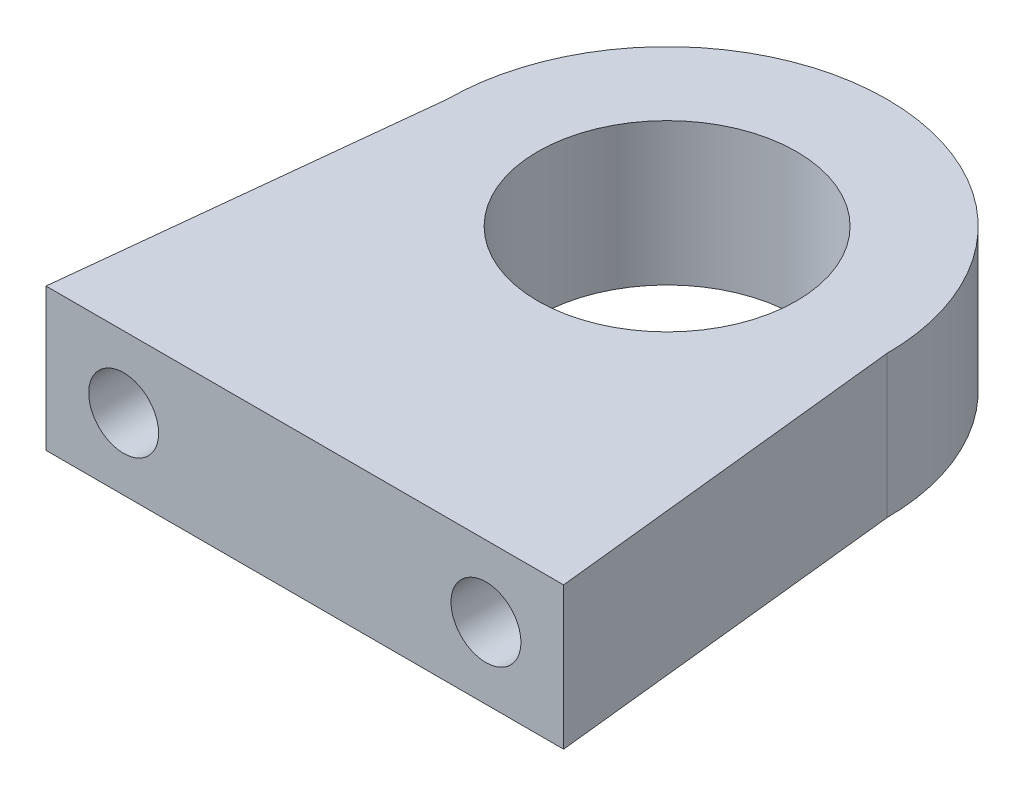
ISO-10303-21;
HEADER;
FILE_DESCRIPTION(('STEP AP214'),'2;1');
FILE_NAME('part.step','',(''),(''),'','','');
FILE_SCHEMA(('AUTOMOTIVE_DESIGN { 1 0 10303 214 1 1 1 1 }'));
ENDSEC;
DATA;
#1=APPLICATION_CONTEXT('core data for automotive mechanical design processes');
#2=APPLICATION_PROTOCOL_DEFINITION('international standard','automotive_design',2000,#1);
#3=PRODUCT_CONTEXT('',#1,'mechanical');
#4=PRODUCT('Part','Part','',(#3));
#5=PRODUCT_RELATED_PRODUCT_CATEGORY('part','',(#4));
#6=PRODUCT_DEFINITION_FORMATION('','',#4);
#7=PRODUCT_DEFINITION_CONTEXT('part definition',#1,'design');
#8=PRODUCT_DEFINITION('design','',#6,#7);
#9=PRODUCT_DEFINITION_SHAPE('','',#8);
#10=(LENGTH_UNIT() NAMED_UNIT(*) SI_UNIT(.MILLI.,.METRE.));
#11=(NAMED_UNIT(*) PLANE_ANGLE_UNIT() SI_UNIT($,.RADIAN.));
#12=(NAMED_UNIT(*) SI_UNIT($,.STERADIAN.) SOLID_ANGLE_UNIT());
#13=UNCERTAINTY_MEASURE_WITH_UNIT(LENGTH_MEASURE(1.E-05),#10,'distance_accuracy_value','');
#14=(GEOMETRIC_REPRESENTATION_CONTEXT(3) GLOBAL_UNCERTAINTY_ASSIGNED_CONTEXT((#13)) GLOBAL_UNIT_ASSIGNED_CONTEXT((#10,
#11,#12)) REPRESENTATION_CONTEXT('',''));
#15=CARTESIAN_POINT('',(0.,0.,0.));
#16=DIRECTION('',(0.,0.,1.));
#17=DIRECTION('',(1.,0.,0.));
#18=AXIS2_PLACEMENT_3D('',#15,#16,#17);
#19=CARTESIAN_POINT('',(0.,5.5,-14.));
#20=DIRECTION('',(0.,-1.,0.));
#21=DIRECTION('',(0.,0.,-1.));
#22=AXIS2_PLACEMENT_3D('',#19,#20,#21);
#23=PLANE('',#22);
#24=DIRECTION('',(1.,0.,0.));
#25=VECTOR('',#24,1.);
#26=CARTESIAN_POINT('',(-10.,5.5,0.));
#27=LINE('',#26,#25);
#28=CARTESIAN_POINT('',(-10.,5.5,0.));
#29=VERTEX_POINT('',#28);
#30=CARTESIAN_POINT('',(10.,5.5,0.));
#31=VERTEX_POINT('',#30);
#32=EDGE_CURVE('E92',#29,#31,#27,.T.);
#33=ORIENTED_EDGE('',*,*,#32,.T.);
#34=DIRECTION('',(-0.106533123634265,0.,-0.994309153919809));
#35=VECTOR('',#34,1.);
#36=CARTESIAN_POINT('',(10.,5.5,0.));
#37=LINE('',#36,#35);
#38=CARTESIAN_POINT('',(8.5,5.5,-14.));
#39=VERTEX_POINT('',#38);
#40=EDGE_CURVE('E87',#31,#39,#37,.T.);
#41=ORIENTED_EDGE('',*,*,#40,.T.);
#42=CARTESIAN_POINT('',(0.,5.5,-14.));
#43=DIRECTION('',(0.,1.,0.));
#44=DIRECTION('',(0.,0.,-1.));
#45=AXIS2_PLACEMENT_3D('',#42,#43,#44);
#46=CIRCLE('',#45,8.5);
#47=CARTESIAN_POINT('',(-8.5,5.5,-14.));
#48=VERTEX_POINT('',#47);
#49=EDGE_CURVE('E90',#39,#48,#46,.T.);
#50=ORIENTED_EDGE('',*,*,#49,.T.);
#51=DIRECTION('',(-0.106533123634265,0.,0.994309153919809));
#52=VECTOR('',#51,1.);
#53=CARTESIAN_POINT('',(-10.,5.5,0.));
#54=LINE('',#53,#52);
#55=EDGE_CURVE('E57',#48,#29,#54,.T.);
#56=ORIENTED_EDGE('',*,*,#55,.T.);
#57=EDGE_LOOP('',(#33,#41,#50,#56));
#58=FACE_BOUND('',#57,.T.);
#59=CARTESIAN_POINT('',(0.,5.5,-14.));
#60=DIRECTION('',(0.,1.,0.));
#61=DIRECTION('',(0.,0.,1.));
#62=AXIS2_PLACEMENT_3D('',#59,#60,#61);
#63=CIRCLE('',#62,5.);
#64=CARTESIAN_POINT('',(0.,5.5,-9.));
#65=VERTEX_POINT('',#64);
#66=EDGE_CURVE('E112',#65,#65,#63,.T.);
#67=ORIENTED_EDGE('',*,*,#66,.F.);
#68=EDGE_LOOP('',(#67));
#69=FACE_BOUND('',#68,.T.);
#70=ADVANCED_FACE('F39',(#58,#69),#23,.F.);
#71=CARTESIAN_POINT('',(0.,0.,-14.));
#72=DIRECTION('',(0.,-1.,0.));
#73=DIRECTION('',(0.,0.,-1.));
#74=AXIS2_PLACEMENT_3D('',#71,#72,#73);
#75=PLANE('',#74);
#76=DIRECTION('',(1.,0.,0.));
#77=VECTOR('',#76,1.);
#78=CARTESIAN_POINT('',(-10.,0.,0.));
#79=LINE('',#78,#77);
#80=CARTESIAN_POINT('',(-10.,0.,0.));
#81=VERTEX_POINT('',#80);
#82=CARTESIAN_POINT('',(10.,0.,0.));
#83=VERTEX_POINT('',#82);
#84=EDGE_CURVE('E108',#81,#83,#79,.T.);
#85=ORIENTED_EDGE('',*,*,#84,.F.);
#86=DIRECTION('',(-0.106533123634265,0.,0.994309153919809));
#87=VECTOR('',#86,1.);
#88=CARTESIAN_POINT('',(-10.,0.,0.));
#89=LINE('',#88,#87);
#90=CARTESIAN_POINT('',(-8.5,0.,-14.));
#91=VERTEX_POINT('',#90);
#92=EDGE_CURVE('E80',#91,#81,#89,.T.);
#93=ORIENTED_EDGE('',*,*,#92,.F.);
#94=CARTESIAN_POINT('',(0.,0.,-14.));
#95=DIRECTION('',(0.,1.,0.));
#96=DIRECTION('',(0.,0.,-1.));
#97=AXIS2_PLACEMENT_3D('',#94,#95,#96);
#98=CIRCLE('',#97,8.5);
#99=CARTESIAN_POINT('',(8.5,0.,-14.));
#100=VERTEX_POINT('',#99);
#101=EDGE_CURVE('E74',#100,#91,#98,.T.);
#102=ORIENTED_EDGE('',*,*,#101,.F.);
#103=DIRECTION('',(-0.106533123634265,0.,-0.994309153919809));
#104=VECTOR('',#103,1.);
#105=CARTESIAN_POINT('',(10.,0.,0.));
#106=LINE('',#105,#104);
#107=EDGE_CURVE('E97',#83,#100,#106,.T.);
#108=ORIENTED_EDGE('',*,*,#107,.F.);
#109=EDGE_LOOP('',(#85,#93,#102,#108));
#110=FACE_BOUND('',#109,.T.);
#111=CARTESIAN_POINT('',(0.,0.,-14.));
#112=DIRECTION('',(0.,1.,0.));
#113=DIRECTION('',(0.,0.,1.));
#114=AXIS2_PLACEMENT_3D('',#111,#112,#113);
#115=CIRCLE('',#114,5.);
#116=CARTESIAN_POINT('',(0.,0.,-9.));
#117=VERTEX_POINT('',#116);
#118=EDGE_CURVE('E130',#117,#117,#115,.T.);
#119=ORIENTED_EDGE('',*,*,#118,.T.);
#120=EDGE_LOOP('',(#119));
#121=FACE_BOUND('',#120,.T.);
#122=ADVANCED_FACE('F125',(#110,#121),#75,.T.);
#123=CARTESIAN_POINT('',(-10.,5.5,0.));
#124=DIRECTION('',(0.,0.,-1.));
#125=DIRECTION('',(-1.,0.,0.));
#126=AXIS2_PLACEMENT_3D('',#123,#124,#125);
#127=PLANE('',#126);
#128=CARTESIAN_POINT('',(-7.,2.75,0.));
#129=DIRECTION('',(0.,0.,1.));
#130=DIRECTION('',(1.,0.,0.));
#131=AXIS2_PLACEMENT_3D('',#128,#129,#130);
#132=CIRCLE('',#131,1.35);
#133=CARTESIAN_POINT('',(-5.65,2.75,0.));
#134=VERTEX_POINT('',#133);
#135=EDGE_CURVE('E146',#134,#134,#132,.T.);
#136=ORIENTED_EDGE('',*,*,#135,.F.);
#137=EDGE_LOOP('',(#136));
#138=FACE_BOUND('',#137,.T.);
#139=CARTESIAN_POINT('',(7.,2.75,0.));
#140=DIRECTION('',(0.,0.,1.));
#141=DIRECTION('',(-1.,0.,0.));
#142=AXIS2_PLACEMENT_3D('',#139,#140,#141);
#143=CIRCLE('',#142,1.35);
#144=CARTESIAN_POINT('',(5.65,2.75,0.));
#145=VERTEX_POINT('',#144);
#146=EDGE_CURVE('E138',#145,#145,#143,.T.);
#147=ORIENTED_EDGE('',*,*,#146,.F.);
#148=EDGE_LOOP('',(#147));
#149=FACE_BOUND('',#148,.T.);
#150=ORIENTED_EDGE('',*,*,#84,.T.);
#151=DIRECTION('',(0.,-1.,0.));
#152=VECTOR('',#151,1.);
#153=CARTESIAN_POINT('',(10.,5.5,0.));
#154=LINE('',#153,#152);
#155=EDGE_CURVE('E11',#31,#83,#154,.T.);
#156=ORIENTED_EDGE('',*,*,#155,.F.);
#157=ORIENTED_EDGE('',*,*,#32,.F.);
#158=DIRECTION('',(0.,-1.,0.));
#159=VECTOR('',#158,1.);
#160=CARTESIAN_POINT('',(-10.,5.5,0.));
#161=LINE('',#160,#159);
#162=EDGE_CURVE('E104',#29,#81,#161,.T.);
#163=ORIENTED_EDGE('',*,*,#162,.T.);
#164=EDGE_LOOP('',(#150,#156,#157,#163));
#165=FACE_BOUND('',#164,.T.);
#166=ADVANCED_FACE('F41',(#138,#149,#165),#127,.F.);
#167=CARTESIAN_POINT('',(10.,5.5,0.));
#168=DIRECTION('',(-0.994309153919809,0.,0.106533123634265));
#169=DIRECTION('',(0.106533123634265,0.,0.994309153919809));
#170=AXIS2_PLACEMENT_3D('',#167,#168,#169);
#171=PLANE('',#170);
#172=ORIENTED_EDGE('',*,*,#107,.T.);
#173=DIRECTION('',(0.,-1.,0.));
#174=VECTOR('',#173,1.);
#175=CARTESIAN_POINT('',(8.5,5.5,-14.));
#176=LINE('',#175,#174);
#177=EDGE_CURVE('E49',#39,#100,#176,.T.);
#178=ORIENTED_EDGE('',*,*,#177,.F.);
#179=ORIENTED_EDGE('',*,*,#40,.F.);
#180=ORIENTED_EDGE('',*,*,#155,.T.);
#181=EDGE_LOOP('',(#172,#178,#179,#180));
#182=FACE_BOUND('',#181,.T.);
#183=ADVANCED_FACE('F96',(#182),#171,.F.);
#184=CARTESIAN_POINT('',(0.,5.5,-14.));
#185=DIRECTION('',(0.,-1.,0.));
#186=DIRECTION('',(0.,0.,-1.));
#187=AXIS2_PLACEMENT_3D('',#184,#185,#186);
#188=CYLINDRICAL_SURFACE('',#187,8.5);
#189=ORIENTED_EDGE('',*,*,#101,.T.);
#190=DIRECTION('',(0.,-1.,0.));
#191=VECTOR('',#190,1.);
#192=CARTESIAN_POINT('',(-8.5,5.5,-14.));
#193=LINE('',#192,#191);
#194=EDGE_CURVE('E99',#48,#91,#193,.T.);
#195=ORIENTED_EDGE('',*,*,#194,.F.);
#196=ORIENTED_EDGE('',*,*,#49,.F.);
#197=ORIENTED_EDGE('',*,*,#177,.T.);
#198=EDGE_LOOP('',(#189,#195,#196,#197));
#199=FACE_BOUND('',#198,.T.);
#200=ADVANCED_FACE('F100',(#199),#188,.T.);
#201=CARTESIAN_POINT('',(-10.,5.5,0.));
#202=DIRECTION('',(0.994309153919809,0.,0.106533123634265));
#203=DIRECTION('',(0.106533123634265,0.,-0.994309153919809));
#204=AXIS2_PLACEMENT_3D('',#201,#202,#203);
#205=PLANE('',#204);
#206=ORIENTED_EDGE('',*,*,#92,.T.);
#207=ORIENTED_EDGE('',*,*,#162,.F.);
#208=ORIENTED_EDGE('',*,*,#55,.F.);
#209=ORIENTED_EDGE('',*,*,#194,.T.);
#210=EDGE_LOOP('',(#206,#207,#208,#209));
#211=FACE_BOUND('',#210,.T.);
#212=ADVANCED_FACE('F122',(#211),#205,.F.);
#213=CARTESIAN_POINT('',(0.,5.5,-14.));
#214=DIRECTION('',(0.,-1.,0.));
#215=DIRECTION('',(0.,0.,-1.));
#216=AXIS2_PLACEMENT_3D('',#213,#214,#215);
#217=CYLINDRICAL_SURFACE('',#216,5.);
#218=ORIENTED_EDGE('',*,*,#66,.T.);
#219=EDGE_LOOP('',(#218));
#220=FACE_BOUND('',#219,.T.);
#221=ORIENTED_EDGE('',*,*,#118,.F.);
#222=EDGE_LOOP('',(#221));
#223=FACE_BOUND('',#222,.T.);
#224=ADVANCED_FACE('F169',(#220,#223),#217,.F.);
#225=CARTESIAN_POINT('',(7.,2.75,-10.));
#226=DIRECTION('',(0.,0.,1.));
#227=DIRECTION('',(1.,0.,0.));
#228=AXIS2_PLACEMENT_3D('',#225,#226,#227);
#229=CYLINDRICAL_SURFACE('',#228,1.35);
#230=CARTESIAN_POINT('',(7.,2.75,-10.));
#231=DIRECTION('',(0.,0.,1.));
#232=DIRECTION('',(-1.,0.,0.));
#233=AXIS2_PLACEMENT_3D('',#230,#231,#232);
#234=CIRCLE('',#233,1.35);
#235=CARTESIAN_POINT('',(5.65,2.75,-10.));
#236=VERTEX_POINT('',#235);
#237=EDGE_CURVE('E142',#236,#236,#234,.T.);
#238=ORIENTED_EDGE('',*,*,#237,.F.);
#239=EDGE_LOOP('',(#238));
#240=FACE_BOUND('',#239,.T.);
#241=ORIENTED_EDGE('',*,*,#146,.T.);
#242=EDGE_LOOP('',(#241));
#243=FACE_BOUND('',#242,.T.);
#244=ADVANCED_FACE('F167',(#240,#243),#229,.F.);
#245=CARTESIAN_POINT('',(7.,2.75,-10.));
#246=DIRECTION('',(0.,0.,-1.));
#247=DIRECTION('',(-1.,0.,0.));
#248=AXIS2_PLACEMENT_3D('',#245,#246,#247);
#249=PLANE('',#248);
#250=ORIENTED_EDGE('',*,*,#237,.T.);
#251=EDGE_LOOP('',(#250));
#252=FACE_BOUND('',#251,.T.);
#253=ADVANCED_FACE('F159',(#252),#249,.F.);
#254=CARTESIAN_POINT('',(-7.,2.75,-10.));
#255=DIRECTION('',(0.,0.,1.));
#256=DIRECTION('',(1.,0.,0.));
#257=AXIS2_PLACEMENT_3D('',#254,#255,#256);
#258=CYLINDRICAL_SURFACE('',#257,1.35);
#259=CARTESIAN_POINT('',(-7.,2.75,-10.));
#260=DIRECTION('',(0.,0.,1.));
#261=DIRECTION('',(1.,0.,0.));
#262=AXIS2_PLACEMENT_3D('',#259,#260,#261);
#263=CIRCLE('',#262,1.35);
#264=CARTESIAN_POINT('',(-5.65,2.75,-10.));
#265=VERTEX_POINT('',#264);
#266=EDGE_CURVE('E134',#265,#265,#263,.T.);
#267=ORIENTED_EDGE('',*,*,#266,.F.);
#268=EDGE_LOOP('',(#267));
#269=FACE_BOUND('',#268,.T.);
#270=ORIENTED_EDGE('',*,*,#135,.T.);
#271=EDGE_LOOP('',(#270));
#272=FACE_BOUND('',#271,.T.);
#273=ADVANCED_FACE('F156',(#269,#272),#258,.F.);
#274=CARTESIAN_POINT('',(-7.,2.75,-10.));
#275=DIRECTION('',(0.,0.,1.));
#276=DIRECTION('',(1.,0.,0.));
#277=AXIS2_PLACEMENT_3D('',#274,#275,#276);
#278=PLANE('',#277);
#279=ORIENTED_EDGE('',*,*,#266,.T.);
#280=EDGE_LOOP('',(#279));
#281=FACE_BOUND('',#280,.T.);
#282=ADVANCED_FACE('F154',(#281),#278,.T.);
#283=CLOSED_SHELL('',(#70,#122,#166,#183,#200,#212,#224,#244,#253,#273,#282));
#284=MANIFOLD_SOLID_BREP('B2',#283);
#285=ADVANCED_BREP_SHAPE_REPRESENTATION('',(#18,#284),#14);
#286=SHAPE_DEFINITION_REPRESENTATION(#9,#285);
ENDSEC;
END-ISO-10303-21;
